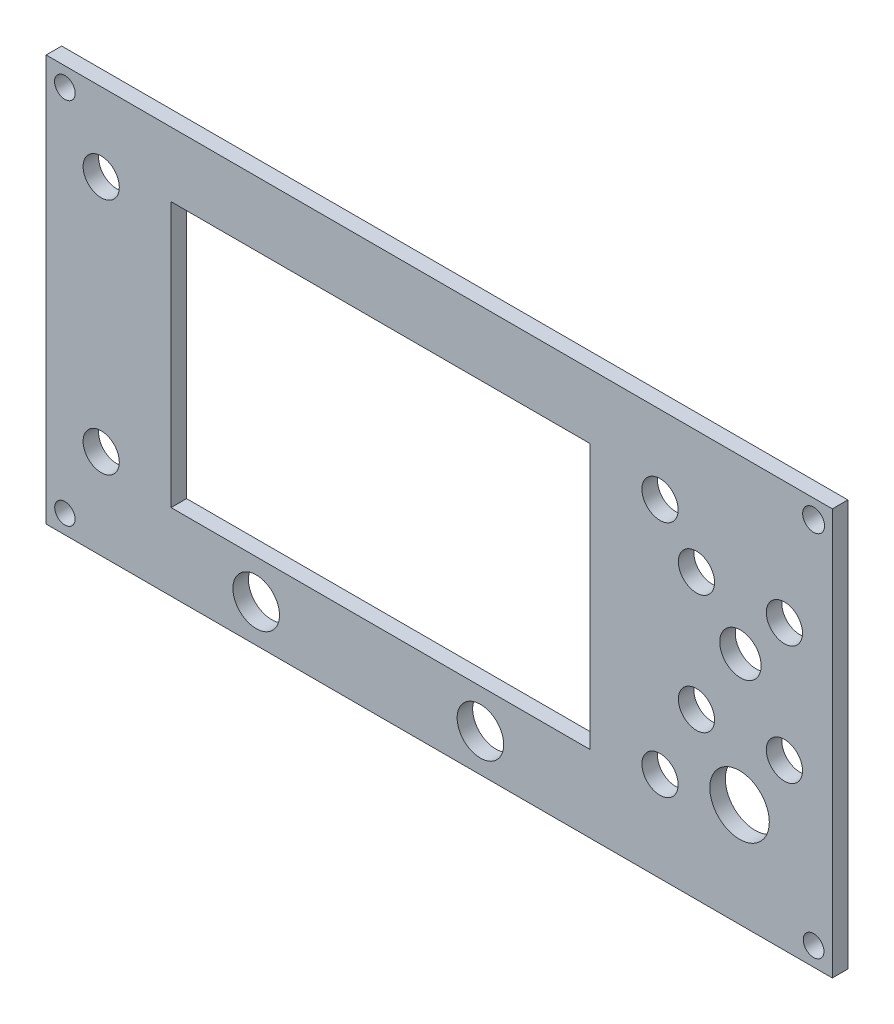
ISO-10303-21;
HEADER;
FILE_DESCRIPTION(('STEP AP214'),'2;1');
FILE_NAME('part.step','',(''),(''),'','','');
FILE_SCHEMA(('AUTOMOTIVE_DESIGN { 1 0 10303 214 1 1 1 1 }'));
ENDSEC;
DATA;
#1=APPLICATION_CONTEXT('core data for automotive mechanical design processes');
#2=APPLICATION_PROTOCOL_DEFINITION('international standard','automotive_design',2000,#1);
#3=PRODUCT_CONTEXT('',#1,'mechanical');
#4=PRODUCT('Part','Part','',(#3));
#5=PRODUCT_RELATED_PRODUCT_CATEGORY('part','',(#4));
#6=PRODUCT_DEFINITION_FORMATION('','',#4);
#7=PRODUCT_DEFINITION_CONTEXT('part definition',#1,'design');
#8=PRODUCT_DEFINITION('design','',#6,#7);
#9=PRODUCT_DEFINITION_SHAPE('','',#8);
#10=(LENGTH_UNIT() NAMED_UNIT(*) SI_UNIT(.MILLI.,.METRE.));
#11=(NAMED_UNIT(*) PLANE_ANGLE_UNIT() SI_UNIT($,.RADIAN.));
#12=(NAMED_UNIT(*) SI_UNIT($,.STERADIAN.) SOLID_ANGLE_UNIT());
#13=UNCERTAINTY_MEASURE_WITH_UNIT(LENGTH_MEASURE(1.E-05),#10,'distance_accuracy_value','');
#14=(GEOMETRIC_REPRESENTATION_CONTEXT(3) GLOBAL_UNCERTAINTY_ASSIGNED_CONTEXT((#13)) GLOBAL_UNIT_ASSIGNED_CONTEXT((#10,
#11,#12)) REPRESENTATION_CONTEXT('',''));
#15=CARTESIAN_POINT('',(0.,0.,0.));
#16=DIRECTION('',(0.,0.,1.));
#17=DIRECTION('',(1.,0.,0.));
#18=AXIS2_PLACEMENT_3D('',#15,#16,#17);
#19=CARTESIAN_POINT('',(-115.589634864552,35.6628504621788,3.8));
#20=DIRECTION('',(0.,0.,1.));
#21=DIRECTION('',(1.,0.,0.));
#22=AXIS2_PLACEMENT_3D('',#19,#20,#21);
#23=PLANE('',#22);
#24=DIRECTION('',(1.,0.,0.));
#25=VECTOR('',#24,1.);
#26=CARTESIAN_POINT('',(-112.589634864552,-38.6113828011498,3.8));
#27=LINE('',#26,#25);
#28=CARTESIAN_POINT('',(-119.832275551671,-38.6113828011498,3.8));
#29=VERTEX_POINT('',#28);
#30=CARTESIAN_POINT('',(32.1074936677452,-38.6113828011498,3.8));
#31=VERTEX_POINT('',#30);
#32=EDGE_CURVE('E103',#29,#31,#27,.T.);
#33=ORIENTED_EDGE('',*,*,#32,.T.);
#34=DIRECTION('',(0.,1.,0.));
#35=VECTOR('',#34,1.);
#36=CARTESIAN_POINT('',(32.1074936677452,32.6628504621788,3.8));
#37=LINE('',#36,#35);
#38=CARTESIAN_POINT('',(32.1074936677452,39.9054911492981,3.8));
#39=VERTEX_POINT('',#38);
#40=EDGE_CURVE('E44',#31,#39,#37,.T.);
#41=ORIENTED_EDGE('',*,*,#40,.T.);
#42=DIRECTION('',(-1.,0.,0.));
#43=VECTOR('',#42,1.);
#44=CARTESIAN_POINT('',(-112.589634864552,39.9054911492981,3.8));
#45=LINE('',#44,#43);
#46=CARTESIAN_POINT('',(-119.832275551672,39.9054911492981,3.8));
#47=VERTEX_POINT('',#46);
#48=EDGE_CURVE('E11',#39,#47,#45,.T.);
#49=ORIENTED_EDGE('',*,*,#48,.T.);
#50=DIRECTION('',(0.,-1.,0.));
#51=VECTOR('',#50,1.);
#52=CARTESIAN_POINT('',(-119.832275551672,32.6628504621788,3.8));
#53=LINE('',#52,#51);
#54=EDGE_CURVE('E107',#47,#29,#53,.T.);
#55=ORIENTED_EDGE('',*,*,#54,.T.);
#56=EDGE_LOOP('',(#33,#41,#49,#55));
#57=FACE_BOUND('',#56,.T.);
#58=CARTESIAN_POINT('',(-35.9055575731451,-31.3167182927098,3.8));
#59=DIRECTION('',(0.,0.,1.));
#60=DIRECTION('',(1.,0.,0.));
#61=AXIS2_PLACEMENT_3D('',#58,#59,#60);
#62=CIRCLE('',#61,4.5);
#63=CARTESIAN_POINT('',(-31.4055575731451,-31.3167182927098,3.8));
#64=VERTEX_POINT('',#63);
#65=EDGE_CURVE('E163',#64,#64,#62,.T.);
#66=ORIENTED_EDGE('',*,*,#65,.F.);
#67=EDGE_LOOP('',(#66));
#68=FACE_BOUND('',#67,.T.);
#69=CARTESIAN_POINT('',(5.84522459718796,-6.79565746544466,3.8));
#70=DIRECTION('',(0.,0.,1.));
#71=DIRECTION('',(1.,0.,0.));
#72=AXIS2_PLACEMENT_3D('',#69,#70,#71);
#73=CIRCLE('',#72,3.5);
#74=CARTESIAN_POINT('',(9.34522459718795,-6.79565746544466,3.8));
#75=VERTEX_POINT('',#74);
#76=EDGE_CURVE('E175',#75,#75,#73,.T.);
#77=ORIENTED_EDGE('',*,*,#76,.F.);
#78=EDGE_LOOP('',(#77));
#79=FACE_BOUND('',#78,.T.);
#80=CARTESIAN_POINT('',(22.845224597188,16.2043425345553,3.8));
#81=DIRECTION('',(0.,0.,1.));
#82=DIRECTION('',(1.,0.,0.));
#83=AXIS2_PLACEMENT_3D('',#80,#81,#82);
#84=CIRCLE('',#83,3.5);
#85=CARTESIAN_POINT('',(26.345224597188,16.2043425345553,3.8));
#86=VERTEX_POINT('',#85);
#87=EDGE_CURVE('E187',#86,#86,#84,.T.);
#88=ORIENTED_EDGE('',*,*,#87,.F.);
#89=EDGE_LOOP('',(#88));
#90=FACE_BOUND('',#89,.T.);
#91=CARTESIAN_POINT('',(14.3452245971879,6.74985267444258,3.8));
#92=DIRECTION('',(0.,0.,1.));
#93=DIRECTION('',(1.,0.,0.));
#94=AXIS2_PLACEMENT_3D('',#91,#92,#93);
#95=CIRCLE('',#94,4.);
#96=CARTESIAN_POINT('',(18.3452245971879,6.74985267444258,3.8));
#97=VERTEX_POINT('',#96);
#98=EDGE_CURVE('E199',#97,#97,#95,.T.);
#99=ORIENTED_EDGE('',*,*,#98,.F.);
#100=EDGE_LOOP('',(#99));
#101=FACE_BOUND('',#100,.T.);
#102=CARTESIAN_POINT('',(-1.1944174376666,-21.1785714285714,3.8));
#103=DIRECTION('',(0.,0.,1.));
#104=DIRECTION('',(1.,0.,0.));
#105=AXIS2_PLACEMENT_3D('',#102,#103,#104);
#106=CIRCLE('',#105,3.5);
#107=CARTESIAN_POINT('',(2.3055825623334,-21.1785714285714,3.8));
#108=VERTEX_POINT('',#107);
#109=EDGE_CURVE('E236',#108,#108,#106,.T.);
#110=ORIENTED_EDGE('',*,*,#109,.F.);
#111=EDGE_LOOP('',(#110));
#112=FACE_BOUND('',#111,.T.);
#113=CARTESIAN_POINT('',(-109.194417437667,24.8214285714286,3.8));
#114=DIRECTION('',(0.,0.,1.));
#115=DIRECTION('',(1.,0.,0.));
#116=AXIS2_PLACEMENT_3D('',#113,#114,#115);
#117=CIRCLE('',#116,3.50000000000001);
#118=CARTESIAN_POINT('',(-105.694417437667,24.8214285714286,3.8));
#119=VERTEX_POINT('',#118);
#120=EDGE_CURVE('E248',#119,#119,#117,.T.);
#121=ORIENTED_EDGE('',*,*,#120,.F.);
#122=EDGE_LOOP('',(#121));
#123=FACE_BOUND('',#122,.T.);
#124=CARTESIAN_POINT('',(-1.19441743766659,24.8214285714286,3.8));
#125=DIRECTION('',(0.,0.,1.));
#126=DIRECTION('',(1.,0.,0.));
#127=AXIS2_PLACEMENT_3D('',#124,#125,#126);
#128=CIRCLE('',#127,3.5);
#129=CARTESIAN_POINT('',(2.30558256233341,24.8214285714286,3.8));
#130=VERTEX_POINT('',#129);
#131=EDGE_CURVE('E242',#130,#130,#128,.T.);
#132=ORIENTED_EDGE('',*,*,#131,.F.);
#133=EDGE_LOOP('',(#132));
#134=FACE_BOUND('',#133,.T.);
#135=CARTESIAN_POINT('',(-109.194417437667,-21.1785714285714,3.8));
#136=DIRECTION('',(0.,0.,1.));
#137=DIRECTION('',(1.,0.,0.));
#138=AXIS2_PLACEMENT_3D('',#135,#136,#137);
#139=CIRCLE('',#138,3.50000000000001);
#140=CARTESIAN_POINT('',(-105.694417437667,-21.1785714285714,3.8));
#141=VERTEX_POINT('',#140);
#142=EDGE_CURVE('E230',#141,#141,#139,.T.);
#143=ORIENTED_EDGE('',*,*,#142,.F.);
#144=EDGE_LOOP('',(#143));
#145=FACE_BOUND('',#144,.T.);
#146=DIRECTION('',(1.,0.,0.));
#147=VECTOR('',#146,1.);
#148=CARTESIAN_POINT('',(-95.6944174376666,-23.7785714285714,3.8));
#149=LINE('',#148,#147);
#150=CARTESIAN_POINT('',(-95.6944174376666,-23.7785714285714,3.8));
#151=VERTEX_POINT('',#150);
#152=CARTESIAN_POINT('',(-14.6944174376666,-23.7785714285714,3.8));
#153=VERTEX_POINT('',#152);
#154=EDGE_CURVE('E206',#151,#153,#149,.T.);
#155=ORIENTED_EDGE('',*,*,#154,.F.);
#156=DIRECTION('',(0.,-1.,0.));
#157=VECTOR('',#156,1.);
#158=CARTESIAN_POINT('',(-95.6944174376666,27.4214285714286,3.8));
#159=LINE('',#158,#157);
#160=CARTESIAN_POINT('',(-95.6944174376666,27.4214285714286,3.8));
#161=VERTEX_POINT('',#160);
#162=EDGE_CURVE('E204',#161,#151,#159,.T.);
#163=ORIENTED_EDGE('',*,*,#162,.F.);
#164=DIRECTION('',(-1.,0.,0.));
#165=VECTOR('',#164,1.);
#166=CARTESIAN_POINT('',(-95.6944174376666,27.4214285714286,3.8));
#167=LINE('',#166,#165);
#168=CARTESIAN_POINT('',(-14.6944174376666,27.4214285714286,3.8));
#169=VERTEX_POINT('',#168);
#170=EDGE_CURVE('E211',#169,#161,#167,.T.);
#171=ORIENTED_EDGE('',*,*,#170,.F.);
#172=DIRECTION('',(0.,1.,0.));
#173=VECTOR('',#172,1.);
#174=CARTESIAN_POINT('',(-14.6944174376666,27.4214285714286,3.8));
#175=LINE('',#174,#173);
#176=EDGE_CURVE('E209',#153,#169,#175,.T.);
#177=ORIENTED_EDGE('',*,*,#176,.F.);
#178=EDGE_LOOP('',(#155,#163,#171,#177));
#179=FACE_BOUND('',#178,.T.);
#180=CARTESIAN_POINT('',(5.84522459718796,16.2043425345553,3.8));
#181=DIRECTION('',(0.,0.,1.));
#182=DIRECTION('',(1.,0.,0.));
#183=AXIS2_PLACEMENT_3D('',#180,#181,#182);
#184=CIRCLE('',#183,3.5);
#185=CARTESIAN_POINT('',(9.34522459718795,16.2043425345553,3.8));
#186=VERTEX_POINT('',#185);
#187=EDGE_CURVE('E193',#186,#186,#184,.T.);
#188=ORIENTED_EDGE('',*,*,#187,.F.);
#189=EDGE_LOOP('',(#188));
#190=FACE_BOUND('',#189,.T.);
#191=CARTESIAN_POINT('',(22.845224597188,-6.79565746544467,3.8));
#192=DIRECTION('',(0.,0.,1.));
#193=DIRECTION('',(1.,0.,0.));
#194=AXIS2_PLACEMENT_3D('',#191,#192,#193);
#195=CIRCLE('',#194,3.5);
#196=CARTESIAN_POINT('',(26.345224597188,-6.79565746544467,3.8));
#197=VERTEX_POINT('',#196);
#198=EDGE_CURVE('E181',#197,#197,#195,.T.);
#199=ORIENTED_EDGE('',*,*,#198,.F.);
#200=EDGE_LOOP('',(#199));
#201=FACE_BOUND('',#200,.T.);
#202=CARTESIAN_POINT('',(14.1765521793274,-18.6113828011496,3.8));
#203=DIRECTION('',(0.,0.,1.));
#204=DIRECTION('',(1.,0.,0.));
#205=AXIS2_PLACEMENT_3D('',#202,#203,#204);
#206=CIRCLE('',#205,5.74999999999999);
#207=CARTESIAN_POINT('',(19.9265521793274,-18.6113828011496,3.8));
#208=VERTEX_POINT('',#207);
#209=EDGE_CURVE('E169',#208,#208,#206,.T.);
#210=ORIENTED_EDGE('',*,*,#209,.F.);
#211=EDGE_LOOP('',(#210));
#212=FACE_BOUND('',#211,.T.);
#213=CARTESIAN_POINT('',(-79.2375087091907,-31.3167182927098,3.8));
#214=DIRECTION('',(0.,0.,1.));
#215=DIRECTION('',(1.,0.,0.));
#216=AXIS2_PLACEMENT_3D('',#213,#214,#215);
#217=CIRCLE('',#216,4.5);
#218=CARTESIAN_POINT('',(-74.7375087091907,-31.3167182927098,3.8));
#219=VERTEX_POINT('',#218);
#220=EDGE_CURVE('E157',#219,#219,#217,.T.);
#221=ORIENTED_EDGE('',*,*,#220,.F.);
#222=EDGE_LOOP('',(#221));
#223=FACE_BOUND('',#222,.T.);
#224=CARTESIAN_POINT('',(-116.210955208112,-34.9900624575901,3.8));
#225=DIRECTION('',(0.,0.,1.));
#226=DIRECTION('',(1.,0.,0.));
#227=AXIS2_PLACEMENT_3D('',#224,#225,#226);
#228=CIRCLE('',#227,1.96530420165224);
#229=CARTESIAN_POINT('',(-114.24565100646,-34.9900624575901,3.8));
#230=VERTEX_POINT('',#229);
#231=EDGE_CURVE('E149',#230,#230,#228,.T.);
#232=ORIENTED_EDGE('',*,*,#231,.F.);
#233=EDGE_LOOP('',(#232));
#234=FACE_BOUND('',#233,.T.);
#235=CARTESIAN_POINT('',(-116.210955208112,36.2841708057384,3.8));
#236=DIRECTION('',(0.,0.,1.));
#237=DIRECTION('',(1.,0.,0.));
#238=AXIS2_PLACEMENT_3D('',#235,#236,#237);
#239=CIRCLE('',#238,2.00000000000001);
#240=CARTESIAN_POINT('',(-114.210955208112,36.2841708057384,3.8));
#241=VERTEX_POINT('',#240);
#242=EDGE_CURVE('E140',#241,#241,#239,.T.);
#243=ORIENTED_EDGE('',*,*,#242,.F.);
#244=EDGE_LOOP('',(#243));
#245=FACE_BOUND('',#244,.T.);
#246=CARTESIAN_POINT('',(28.4861733241856,36.2841708057384,3.8));
#247=DIRECTION('',(0.,0.,1.));
#248=DIRECTION('',(1.,0.,0.));
#249=AXIS2_PLACEMENT_3D('',#246,#247,#248);
#250=CIRCLE('',#249,2.11348636938539);
#251=CARTESIAN_POINT('',(30.599659693571,36.2841708057384,3.8));
#252=VERTEX_POINT('',#251);
#253=EDGE_CURVE('E129',#252,#252,#250,.T.);
#254=ORIENTED_EDGE('',*,*,#253,.F.);
#255=EDGE_LOOP('',(#254));
#256=FACE_BOUND('',#255,.T.);
#257=CARTESIAN_POINT('',(28.4861733241856,-34.9900624575901,3.8));
#258=DIRECTION('',(0.,0.,1.));
#259=DIRECTION('',(1.,0.,0.));
#260=AXIS2_PLACEMENT_3D('',#257,#258,#259);
#261=CIRCLE('',#260,2.00000000000001);
#262=CARTESIAN_POINT('',(30.4861733241856,-34.9900624575901,3.8));
#263=VERTEX_POINT('',#262);
#264=EDGE_CURVE('E126',#263,#263,#261,.T.);
#265=ORIENTED_EDGE('',*,*,#264,.F.);
#266=EDGE_LOOP('',(#265));
#267=FACE_BOUND('',#266,.T.);
#268=ADVANCED_FACE('F35',(#57,#68,#79,#90,#101,#112,#123,#134,#145,#179,#190,#201,#212,#223,
#234,#245,#256,#267),#23,.T.);
#269=CARTESIAN_POINT('',(-115.589634864552,35.6628504621788,0.8));
#270=DIRECTION('',(0.,0.,1.));
#271=DIRECTION('',(1.,0.,0.));
#272=AXIS2_PLACEMENT_3D('',#269,#270,#271);
#273=PLANE('',#272);
#274=DIRECTION('',(0.,1.,0.));
#275=VECTOR('',#274,1.);
#276=CARTESIAN_POINT('',(32.1074936677452,32.6628504621788,0.8));
#277=LINE('',#276,#275);
#278=CARTESIAN_POINT('',(32.1074936677452,-38.6113828011498,0.8));
#279=VERTEX_POINT('',#278);
#280=CARTESIAN_POINT('',(32.1074936677452,39.9054911492981,0.8));
#281=VERTEX_POINT('',#280);
#282=EDGE_CURVE('E256',#279,#281,#277,.T.);
#283=ORIENTED_EDGE('',*,*,#282,.F.);
#284=DIRECTION('',(1.,0.,0.));
#285=VECTOR('',#284,1.);
#286=CARTESIAN_POINT('',(-112.589634864552,-38.6113828011498,0.8));
#287=LINE('',#286,#285);
#288=CARTESIAN_POINT('',(-119.832275551671,-38.6113828011498,0.8));
#289=VERTEX_POINT('',#288);
#290=EDGE_CURVE('E123',#289,#279,#287,.T.);
#291=ORIENTED_EDGE('',*,*,#290,.F.);
#292=DIRECTION('',(0.,-1.,0.));
#293=VECTOR('',#292,1.);
#294=CARTESIAN_POINT('',(-119.832275551672,32.6628504621788,0.8));
#295=LINE('',#294,#293);
#296=CARTESIAN_POINT('',(-119.832275551672,39.9054911492981,0.8));
#297=VERTEX_POINT('',#296);
#298=EDGE_CURVE('E251',#297,#289,#295,.T.);
#299=ORIENTED_EDGE('',*,*,#298,.F.);
#300=DIRECTION('',(-1.,0.,0.));
#301=VECTOR('',#300,1.);
#302=CARTESIAN_POINT('',(-112.589634864552,39.9054911492981,0.8));
#303=LINE('',#302,#301);
#304=EDGE_CURVE('E39',#281,#297,#303,.T.);
#305=ORIENTED_EDGE('',*,*,#304,.F.);
#306=EDGE_LOOP('',(#283,#291,#299,#305));
#307=FACE_BOUND('',#306,.T.);
#308=CARTESIAN_POINT('',(28.4861733241856,36.2841708057384,0.8));
#309=DIRECTION('',(0.,0.,1.));
#310=DIRECTION('',(1.,0.,0.));
#311=AXIS2_PLACEMENT_3D('',#308,#309,#310);
#312=CIRCLE('',#311,2.11348636938539);
#313=CARTESIAN_POINT('',(30.599659693571,36.2841708057384,0.8));
#314=VERTEX_POINT('',#313);
#315=EDGE_CURVE('E125',#314,#314,#312,.T.);
#316=ORIENTED_EDGE('',*,*,#315,.T.);
#317=EDGE_LOOP('',(#316));
#318=FACE_BOUND('',#317,.T.);
#319=CARTESIAN_POINT('',(-116.210955208112,-34.9900624575901,0.8));
#320=DIRECTION('',(0.,0.,1.));
#321=DIRECTION('',(1.,0.,0.));
#322=AXIS2_PLACEMENT_3D('',#319,#320,#321);
#323=CIRCLE('',#322,1.96530420165224);
#324=CARTESIAN_POINT('',(-114.24565100646,-34.9900624575901,0.8));
#325=VERTEX_POINT('',#324);
#326=EDGE_CURVE('E148',#325,#325,#323,.T.);
#327=ORIENTED_EDGE('',*,*,#326,.T.);
#328=EDGE_LOOP('',(#327));
#329=FACE_BOUND('',#328,.T.);
#330=CARTESIAN_POINT('',(-109.194417437667,-21.1785714285714,0.8));
#331=DIRECTION('',(0.,0.,1.));
#332=DIRECTION('',(1.,0.,0.));
#333=AXIS2_PLACEMENT_3D('',#330,#331,#332);
#334=CIRCLE('',#333,3.50000000000001);
#335=CARTESIAN_POINT('',(-105.694417437667,-21.1785714285714,0.8));
#336=VERTEX_POINT('',#335);
#337=EDGE_CURVE('E229',#336,#336,#334,.T.);
#338=ORIENTED_EDGE('',*,*,#337,.T.);
#339=EDGE_LOOP('',(#338));
#340=FACE_BOUND('',#339,.T.);
#341=CARTESIAN_POINT('',(-1.1944174376666,-21.1785714285714,0.8));
#342=DIRECTION('',(0.,0.,1.));
#343=DIRECTION('',(1.,0.,0.));
#344=AXIS2_PLACEMENT_3D('',#341,#342,#343);
#345=CIRCLE('',#344,3.5);
#346=CARTESIAN_POINT('',(2.3055825623334,-21.1785714285714,0.8));
#347=VERTEX_POINT('',#346);
#348=EDGE_CURVE('E233',#347,#347,#345,.T.);
#349=ORIENTED_EDGE('',*,*,#348,.T.);
#350=EDGE_LOOP('',(#349));
#351=FACE_BOUND('',#350,.T.);
#352=CARTESIAN_POINT('',(-1.19441743766659,24.8214285714286,0.8));
#353=DIRECTION('',(0.,0.,1.));
#354=DIRECTION('',(1.,0.,0.));
#355=AXIS2_PLACEMENT_3D('',#352,#353,#354);
#356=CIRCLE('',#355,3.5);
#357=CARTESIAN_POINT('',(2.30558256233341,24.8214285714286,0.8));
#358=VERTEX_POINT('',#357);
#359=EDGE_CURVE('E239',#358,#358,#356,.T.);
#360=ORIENTED_EDGE('',*,*,#359,.T.);
#361=EDGE_LOOP('',(#360));
#362=FACE_BOUND('',#361,.T.);
#363=CARTESIAN_POINT('',(-109.194417437667,24.8214285714286,0.8));
#364=DIRECTION('',(0.,0.,1.));
#365=DIRECTION('',(1.,0.,0.));
#366=AXIS2_PLACEMENT_3D('',#363,#364,#365);
#367=CIRCLE('',#366,3.50000000000001);
#368=CARTESIAN_POINT('',(-105.694417437667,24.8214285714286,0.8));
#369=VERTEX_POINT('',#368);
#370=EDGE_CURVE('E245',#369,#369,#367,.T.);
#371=ORIENTED_EDGE('',*,*,#370,.T.);
#372=EDGE_LOOP('',(#371));
#373=FACE_BOUND('',#372,.T.);
#374=DIRECTION('',(0.,-1.,0.));
#375=VECTOR('',#374,1.);
#376=CARTESIAN_POINT('',(-95.6944174376666,27.4214285714286,0.8));
#377=LINE('',#376,#375);
#378=CARTESIAN_POINT('',(-95.6944174376666,27.4214285714286,0.8));
#379=VERTEX_POINT('',#378);
#380=CARTESIAN_POINT('',(-95.6944174376666,-23.7785714285714,0.8));
#381=VERTEX_POINT('',#380);
#382=EDGE_CURVE('E60',#379,#381,#377,.T.);
#383=ORIENTED_EDGE('',*,*,#382,.T.);
#384=DIRECTION('',(1.,0.,0.));
#385=VECTOR('',#384,1.);
#386=CARTESIAN_POINT('',(-95.6944174376666,-23.7785714285714,0.8));
#387=LINE('',#386,#385);
#388=CARTESIAN_POINT('',(-14.6944174376666,-23.7785714285714,0.8));
#389=VERTEX_POINT('',#388);
#390=EDGE_CURVE('E215',#381,#389,#387,.T.);
#391=ORIENTED_EDGE('',*,*,#390,.T.);
#392=DIRECTION('',(0.,1.,0.));
#393=VECTOR('',#392,1.);
#394=CARTESIAN_POINT('',(-14.6944174376666,27.4214285714286,0.8));
#395=LINE('',#394,#393);
#396=CARTESIAN_POINT('',(-14.6944174376666,27.4214285714286,0.8));
#397=VERTEX_POINT('',#396);
#398=EDGE_CURVE('E218',#389,#397,#395,.T.);
#399=ORIENTED_EDGE('',*,*,#398,.T.);
#400=DIRECTION('',(-1.,0.,0.));
#401=VECTOR('',#400,1.);
#402=CARTESIAN_POINT('',(-95.6944174376666,27.4214285714286,0.8));
#403=LINE('',#402,#401);
#404=EDGE_CURVE('E207',#397,#379,#403,.T.);
#405=ORIENTED_EDGE('',*,*,#404,.T.);
#406=EDGE_LOOP('',(#383,#391,#399,#405));
#407=FACE_BOUND('',#406,.T.);
#408=CARTESIAN_POINT('',(14.3452245971879,6.74985267444258,0.8));
#409=DIRECTION('',(0.,0.,1.));
#410=DIRECTION('',(1.,0.,0.));
#411=AXIS2_PLACEMENT_3D('',#408,#409,#410);
#412=CIRCLE('',#411,4.);
#413=CARTESIAN_POINT('',(18.3452245971879,6.74985267444258,0.8));
#414=VERTEX_POINT('',#413);
#415=EDGE_CURVE('E196',#414,#414,#412,.T.);
#416=ORIENTED_EDGE('',*,*,#415,.T.);
#417=EDGE_LOOP('',(#416));
#418=FACE_BOUND('',#417,.T.);
#419=CARTESIAN_POINT('',(5.84522459718796,16.2043425345553,0.8));
#420=DIRECTION('',(0.,0.,1.));
#421=DIRECTION('',(1.,0.,0.));
#422=AXIS2_PLACEMENT_3D('',#419,#420,#421);
#423=CIRCLE('',#422,3.5);
#424=CARTESIAN_POINT('',(9.34522459718795,16.2043425345553,0.8));
#425=VERTEX_POINT('',#424);
#426=EDGE_CURVE('E190',#425,#425,#423,.T.);
#427=ORIENTED_EDGE('',*,*,#426,.T.);
#428=EDGE_LOOP('',(#427));
#429=FACE_BOUND('',#428,.T.);
#430=CARTESIAN_POINT('',(22.845224597188,16.2043425345553,0.8));
#431=DIRECTION('',(0.,0.,1.));
#432=DIRECTION('',(1.,0.,0.));
#433=AXIS2_PLACEMENT_3D('',#430,#431,#432);
#434=CIRCLE('',#433,3.5);
#435=CARTESIAN_POINT('',(26.345224597188,16.2043425345553,0.8));
#436=VERTEX_POINT('',#435);
#437=EDGE_CURVE('E184',#436,#436,#434,.T.);
#438=ORIENTED_EDGE('',*,*,#437,.T.);
#439=EDGE_LOOP('',(#438));
#440=FACE_BOUND('',#439,.T.);
#441=CARTESIAN_POINT('',(22.845224597188,-6.79565746544467,0.8));
#442=DIRECTION('',(0.,0.,1.));
#443=DIRECTION('',(1.,0.,0.));
#444=AXIS2_PLACEMENT_3D('',#441,#442,#443);
#445=CIRCLE('',#444,3.5);
#446=CARTESIAN_POINT('',(26.345224597188,-6.79565746544467,0.8));
#447=VERTEX_POINT('',#446);
#448=EDGE_CURVE('E178',#447,#447,#445,.T.);
#449=ORIENTED_EDGE('',*,*,#448,.T.);
#450=EDGE_LOOP('',(#449));
#451=FACE_BOUND('',#450,.T.);
#452=CARTESIAN_POINT('',(5.84522459718796,-6.79565746544466,0.8));
#453=DIRECTION('',(0.,0.,1.));
#454=DIRECTION('',(1.,0.,0.));
#455=AXIS2_PLACEMENT_3D('',#452,#453,#454);
#456=CIRCLE('',#455,3.5);
#457=CARTESIAN_POINT('',(9.34522459718795,-6.79565746544466,0.8));
#458=VERTEX_POINT('',#457);
#459=EDGE_CURVE('E172',#458,#458,#456,.T.);
#460=ORIENTED_EDGE('',*,*,#459,.T.);
#461=EDGE_LOOP('',(#460));
#462=FACE_BOUND('',#461,.T.);
#463=CARTESIAN_POINT('',(14.1765521793274,-18.6113828011496,0.8));
#464=DIRECTION('',(0.,0.,1.));
#465=DIRECTION('',(1.,0.,0.));
#466=AXIS2_PLACEMENT_3D('',#463,#464,#465);
#467=CIRCLE('',#466,5.74999999999999);
#468=CARTESIAN_POINT('',(19.9265521793274,-18.6113828011496,0.8));
#469=VERTEX_POINT('',#468);
#470=EDGE_CURVE('E166',#469,#469,#467,.T.);
#471=ORIENTED_EDGE('',*,*,#470,.T.);
#472=EDGE_LOOP('',(#471));
#473=FACE_BOUND('',#472,.T.);
#474=CARTESIAN_POINT('',(-35.9055575731451,-31.3167182927098,0.8));
#475=DIRECTION('',(0.,0.,1.));
#476=DIRECTION('',(1.,0.,0.));
#477=AXIS2_PLACEMENT_3D('',#474,#475,#476);
#478=CIRCLE('',#477,4.5);
#479=CARTESIAN_POINT('',(-31.4055575731451,-31.3167182927098,0.8));
#480=VERTEX_POINT('',#479);
#481=EDGE_CURVE('E160',#480,#480,#478,.T.);
#482=ORIENTED_EDGE('',*,*,#481,.T.);
#483=EDGE_LOOP('',(#482));
#484=FACE_BOUND('',#483,.T.);
#485=CARTESIAN_POINT('',(-79.2375087091907,-31.3167182927098,0.8));
#486=DIRECTION('',(0.,0.,1.));
#487=DIRECTION('',(1.,0.,0.));
#488=AXIS2_PLACEMENT_3D('',#485,#486,#487);
#489=CIRCLE('',#488,4.5);
#490=CARTESIAN_POINT('',(-74.7375087091907,-31.3167182927098,0.8));
#491=VERTEX_POINT('',#490);
#492=EDGE_CURVE('E156',#491,#491,#489,.T.);
#493=ORIENTED_EDGE('',*,*,#492,.T.);
#494=EDGE_LOOP('',(#493));
#495=FACE_BOUND('',#494,.T.);
#496=CARTESIAN_POINT('',(-116.210955208112,36.2841708057384,0.8));
#497=DIRECTION('',(0.,0.,1.));
#498=DIRECTION('',(1.,0.,0.));
#499=AXIS2_PLACEMENT_3D('',#496,#497,#498);
#500=CIRCLE('',#499,2.00000000000001);
#501=CARTESIAN_POINT('',(-114.210955208112,36.2841708057384,0.8));
#502=VERTEX_POINT('',#501);
#503=EDGE_CURVE('E139',#502,#502,#500,.T.);
#504=ORIENTED_EDGE('',*,*,#503,.T.);
#505=EDGE_LOOP('',(#504));
#506=FACE_BOUND('',#505,.T.);
#507=CARTESIAN_POINT('',(28.4861733241856,-34.9900624575901,0.8));
#508=DIRECTION('',(0.,0.,1.));
#509=DIRECTION('',(1.,0.,0.));
#510=AXIS2_PLACEMENT_3D('',#507,#508,#509);
#511=CIRCLE('',#510,2.00000000000001);
#512=CARTESIAN_POINT('',(30.4861733241856,-34.9900624575901,0.8));
#513=VERTEX_POINT('',#512);
#514=EDGE_CURVE('E132',#513,#513,#511,.T.);
#515=ORIENTED_EDGE('',*,*,#514,.T.);
#516=EDGE_LOOP('',(#515));
#517=FACE_BOUND('',#516,.T.);
#518=ADVANCED_FACE('F264',(#307,#318,#329,#340,#351,#362,#373,#407,#418,#429,#440,#451,#462,
#473,#484,#495,#506,#517),#273,.F.);
#519=CARTESIAN_POINT('',(-119.832275551672,32.6628504621788,3.8));
#520=DIRECTION('',(1.,0.,0.));
#521=DIRECTION('',(0.,1.,0.));
#522=AXIS2_PLACEMENT_3D('',#519,#520,#521);
#523=PLANE('',#522);
#524=ORIENTED_EDGE('',*,*,#298,.T.);
#525=DIRECTION('',(0.,0.,-1.));
#526=VECTOR('',#525,1.);
#527=CARTESIAN_POINT('',(-119.832275551671,-38.6113828011498,3.8));
#528=LINE('',#527,#526);
#529=EDGE_CURVE('E152',#29,#289,#528,.T.);
#530=ORIENTED_EDGE('',*,*,#529,.F.);
#531=ORIENTED_EDGE('',*,*,#54,.F.);
#532=DIRECTION('',(0.,0.,-1.));
#533=VECTOR('',#532,1.);
#534=CARTESIAN_POINT('',(-119.832275551672,39.9054911492981,3.8));
#535=LINE('',#534,#533);
#536=EDGE_CURVE('E143',#47,#297,#535,.T.);
#537=ORIENTED_EDGE('',*,*,#536,.T.);
#538=EDGE_LOOP('',(#524,#530,#531,#537));
#539=FACE_BOUND('',#538,.T.);
#540=ADVANCED_FACE('F37',(#539),#523,.F.);
#541=CARTESIAN_POINT('',(-112.589634864552,-38.6113828011498,3.8));
#542=DIRECTION('',(0.,1.,0.));
#543=DIRECTION('',(0.,0.,1.));
#544=AXIS2_PLACEMENT_3D('',#541,#542,#543);
#545=PLANE('',#544);
#546=ORIENTED_EDGE('',*,*,#290,.T.);
#547=DIRECTION('',(0.,0.,-1.));
#548=VECTOR('',#547,1.);
#549=CARTESIAN_POINT('',(32.1074936677452,-38.6113828011498,3.8));
#550=LINE('',#549,#548);
#551=EDGE_CURVE('E117',#31,#279,#550,.T.);
#552=ORIENTED_EDGE('',*,*,#551,.F.);
#553=ORIENTED_EDGE('',*,*,#32,.F.);
#554=ORIENTED_EDGE('',*,*,#529,.T.);
#555=EDGE_LOOP('',(#546,#552,#553,#554));
#556=FACE_BOUND('',#555,.T.);
#557=ADVANCED_FACE('F121',(#556),#545,.F.);
#558=CARTESIAN_POINT('',(32.1074936677452,32.6628504621788,3.8));
#559=DIRECTION('',(-1.,0.,0.));
#560=DIRECTION('',(0.,-1.,0.));
#561=AXIS2_PLACEMENT_3D('',#558,#559,#560);
#562=PLANE('',#561);
#563=ORIENTED_EDGE('',*,*,#282,.T.);
#564=DIRECTION('',(0.,0.,-1.));
#565=VECTOR('',#564,1.);
#566=CARTESIAN_POINT('',(32.1074936677452,39.9054911492981,3.8));
#567=LINE('',#566,#565);
#568=EDGE_CURVE('E119',#39,#281,#567,.T.);
#569=ORIENTED_EDGE('',*,*,#568,.F.);
#570=ORIENTED_EDGE('',*,*,#40,.F.);
#571=ORIENTED_EDGE('',*,*,#551,.T.);
#572=EDGE_LOOP('',(#563,#569,#570,#571));
#573=FACE_BOUND('',#572,.T.);
#574=ADVANCED_FACE('F116',(#573),#562,.F.);
#575=CARTESIAN_POINT('',(-112.589634864552,39.9054911492981,3.8));
#576=DIRECTION('',(0.,-1.,0.));
#577=DIRECTION('',(0.,0.,-1.));
#578=AXIS2_PLACEMENT_3D('',#575,#576,#577);
#579=PLANE('',#578);
#580=ORIENTED_EDGE('',*,*,#304,.T.);
#581=ORIENTED_EDGE('',*,*,#536,.F.);
#582=ORIENTED_EDGE('',*,*,#48,.F.);
#583=ORIENTED_EDGE('',*,*,#568,.T.);
#584=EDGE_LOOP('',(#580,#581,#582,#583));
#585=FACE_BOUND('',#584,.T.);
#586=ADVANCED_FACE('F261',(#585),#579,.F.);
#587=CARTESIAN_POINT('',(-109.194417437667,24.8214285714286,3.8));
#588=DIRECTION('',(0.,0.,-1.));
#589=DIRECTION('',(-1.,0.,0.));
#590=AXIS2_PLACEMENT_3D('',#587,#588,#589);
#591=CYLINDRICAL_SURFACE('',#590,3.50000000000001);
#592=ORIENTED_EDGE('',*,*,#120,.T.);
#593=EDGE_LOOP('',(#592));
#594=FACE_BOUND('',#593,.T.);
#595=ORIENTED_EDGE('',*,*,#370,.F.);
#596=EDGE_LOOP('',(#595));
#597=FACE_BOUND('',#596,.T.);
#598=ADVANCED_FACE('F318',(#594,#597),#591,.F.);
#599=CARTESIAN_POINT('',(-1.19441743766659,24.8214285714286,3.8));
#600=DIRECTION('',(0.,0.,-1.));
#601=DIRECTION('',(-1.,0.,0.));
#602=AXIS2_PLACEMENT_3D('',#599,#600,#601);
#603=CYLINDRICAL_SURFACE('',#602,3.5);
#604=ORIENTED_EDGE('',*,*,#131,.T.);
#605=EDGE_LOOP('',(#604));
#606=FACE_BOUND('',#605,.T.);
#607=ORIENTED_EDGE('',*,*,#359,.F.);
#608=EDGE_LOOP('',(#607));
#609=FACE_BOUND('',#608,.T.);
#610=ADVANCED_FACE('F483',(#606,#609),#603,.F.);
#611=CARTESIAN_POINT('',(-1.1944174376666,-21.1785714285714,3.8));
#612=DIRECTION('',(0.,0.,-1.));
#613=DIRECTION('',(-1.,0.,0.));
#614=AXIS2_PLACEMENT_3D('',#611,#612,#613);
#615=CYLINDRICAL_SURFACE('',#614,3.5);
#616=ORIENTED_EDGE('',*,*,#109,.T.);
#617=EDGE_LOOP('',(#616));
#618=FACE_BOUND('',#617,.T.);
#619=ORIENTED_EDGE('',*,*,#348,.F.);
#620=EDGE_LOOP('',(#619));
#621=FACE_BOUND('',#620,.T.);
#622=ADVANCED_FACE('F473',(#618,#621),#615,.F.);
#623=CARTESIAN_POINT('',(-109.194417437667,-21.1785714285714,3.8));
#624=DIRECTION('',(0.,0.,-1.));
#625=DIRECTION('',(-1.,0.,0.));
#626=AXIS2_PLACEMENT_3D('',#623,#624,#625);
#627=CYLINDRICAL_SURFACE('',#626,3.50000000000001);
#628=ORIENTED_EDGE('',*,*,#142,.T.);
#629=EDGE_LOOP('',(#628));
#630=FACE_BOUND('',#629,.T.);
#631=ORIENTED_EDGE('',*,*,#337,.F.);
#632=EDGE_LOOP('',(#631));
#633=FACE_BOUND('',#632,.T.);
#634=ADVANCED_FACE('F464',(#630,#633),#627,.F.);
#635=CARTESIAN_POINT('',(-95.6944174376666,27.4214285714286,3.8));
#636=DIRECTION('',(1.,0.,0.));
#637=DIRECTION('',(0.,0.,-1.));
#638=AXIS2_PLACEMENT_3D('',#635,#636,#637);
#639=PLANE('',#638);
#640=ORIENTED_EDGE('',*,*,#382,.F.);
#641=DIRECTION('',(0.,0.,-1.));
#642=VECTOR('',#641,1.);
#643=CARTESIAN_POINT('',(-95.6944174376666,27.4214285714286,3.8));
#644=LINE('',#643,#642);
#645=EDGE_CURVE('E213',#161,#379,#644,.T.);
#646=ORIENTED_EDGE('',*,*,#645,.F.);
#647=ORIENTED_EDGE('',*,*,#162,.T.);
#648=DIRECTION('',(0.,0.,-1.));
#649=VECTOR('',#648,1.);
#650=CARTESIAN_POINT('',(-95.6944174376666,-23.7785714285714,3.8));
#651=LINE('',#650,#649);
#652=EDGE_CURVE('E227',#151,#381,#651,.T.);
#653=ORIENTED_EDGE('',*,*,#652,.T.);
#654=EDGE_LOOP('',(#640,#646,#647,#653));
#655=FACE_BOUND('',#654,.T.);
#656=ADVANCED_FACE('F454',(#655),#639,.T.);
#657=CARTESIAN_POINT('',(-95.6944174376666,-23.7785714285714,3.8));
#658=DIRECTION('',(0.,1.,0.));
#659=DIRECTION('',(0.,0.,1.));
#660=AXIS2_PLACEMENT_3D('',#657,#658,#659);
#661=PLANE('',#660);
#662=ORIENTED_EDGE('',*,*,#390,.F.);
#663=ORIENTED_EDGE('',*,*,#652,.F.);
#664=ORIENTED_EDGE('',*,*,#154,.T.);
#665=DIRECTION('',(0.,0.,-1.));
#666=VECTOR('',#665,1.);
#667=CARTESIAN_POINT('',(-14.6944174376666,-23.7785714285714,3.8));
#668=LINE('',#667,#666);
#669=EDGE_CURVE('E225',#153,#389,#668,.T.);
#670=ORIENTED_EDGE('',*,*,#669,.T.);
#671=EDGE_LOOP('',(#662,#663,#664,#670));
#672=FACE_BOUND('',#671,.T.);
#673=ADVANCED_FACE('F444',(#672),#661,.T.);
#674=CARTESIAN_POINT('',(-14.6944174376666,27.4214285714286,3.8));
#675=DIRECTION('',(-1.,0.,0.));
#676=DIRECTION('',(0.,0.,1.));
#677=AXIS2_PLACEMENT_3D('',#674,#675,#676);
#678=PLANE('',#677);
#679=ORIENTED_EDGE('',*,*,#398,.F.);
#680=ORIENTED_EDGE('',*,*,#669,.F.);
#681=ORIENTED_EDGE('',*,*,#176,.T.);
#682=DIRECTION('',(0.,0.,-1.));
#683=VECTOR('',#682,1.);
#684=CARTESIAN_POINT('',(-14.6944174376666,27.4214285714286,3.8));
#685=LINE('',#684,#683);
#686=EDGE_CURVE('E52',#169,#397,#685,.T.);
#687=ORIENTED_EDGE('',*,*,#686,.T.);
#688=EDGE_LOOP('',(#679,#680,#681,#687));
#689=FACE_BOUND('',#688,.T.);
#690=ADVANCED_FACE('F435',(#689),#678,.T.);
#691=CARTESIAN_POINT('',(-95.6944174376666,27.4214285714286,3.8));
#692=DIRECTION('',(0.,-1.,0.));
#693=DIRECTION('',(0.,0.,-1.));
#694=AXIS2_PLACEMENT_3D('',#691,#692,#693);
#695=PLANE('',#694);
#696=ORIENTED_EDGE('',*,*,#404,.F.);
#697=ORIENTED_EDGE('',*,*,#686,.F.);
#698=ORIENTED_EDGE('',*,*,#170,.T.);
#699=ORIENTED_EDGE('',*,*,#645,.T.);
#700=EDGE_LOOP('',(#696,#697,#698,#699));
#701=FACE_BOUND('',#700,.T.);
#702=ADVANCED_FACE('F425',(#701),#695,.T.);
#703=CARTESIAN_POINT('',(14.3452245971879,6.74985267444258,3.8));
#704=DIRECTION('',(0.,0.,-1.));
#705=DIRECTION('',(-1.,0.,0.));
#706=AXIS2_PLACEMENT_3D('',#703,#704,#705);
#707=CYLINDRICAL_SURFACE('',#706,4.);
#708=ORIENTED_EDGE('',*,*,#98,.T.);
#709=EDGE_LOOP('',(#708));
#710=FACE_BOUND('',#709,.T.);
#711=ORIENTED_EDGE('',*,*,#415,.F.);
#712=EDGE_LOOP('',(#711));
#713=FACE_BOUND('',#712,.T.);
#714=ADVANCED_FACE('F415',(#710,#713),#707,.F.);
#715=CARTESIAN_POINT('',(5.84522459718796,16.2043425345553,3.8));
#716=DIRECTION('',(0.,0.,-1.));
#717=DIRECTION('',(-1.,0.,0.));
#718=AXIS2_PLACEMENT_3D('',#715,#716,#717);
#719=CYLINDRICAL_SURFACE('',#718,3.5);
#720=ORIENTED_EDGE('',*,*,#187,.T.);
#721=EDGE_LOOP('',(#720));
#722=FACE_BOUND('',#721,.T.);
#723=ORIENTED_EDGE('',*,*,#426,.F.);
#724=EDGE_LOOP('',(#723));
#725=FACE_BOUND('',#724,.T.);
#726=ADVANCED_FACE('F405',(#722,#725),#719,.F.);
#727=CARTESIAN_POINT('',(22.845224597188,16.2043425345553,3.8));
#728=DIRECTION('',(0.,0.,-1.));
#729=DIRECTION('',(-1.,0.,0.));
#730=AXIS2_PLACEMENT_3D('',#727,#728,#729);
#731=CYLINDRICAL_SURFACE('',#730,3.5);
#732=ORIENTED_EDGE('',*,*,#87,.T.);
#733=EDGE_LOOP('',(#732));
#734=FACE_BOUND('',#733,.T.);
#735=ORIENTED_EDGE('',*,*,#437,.F.);
#736=EDGE_LOOP('',(#735));
#737=FACE_BOUND('',#736,.T.);
#738=ADVANCED_FACE('F395',(#734,#737),#731,.F.);
#739=CARTESIAN_POINT('',(22.845224597188,-6.79565746544467,3.8));
#740=DIRECTION('',(0.,0.,-1.));
#741=DIRECTION('',(-1.,0.,0.));
#742=AXIS2_PLACEMENT_3D('',#739,#740,#741);
#743=CYLINDRICAL_SURFACE('',#742,3.5);
#744=ORIENTED_EDGE('',*,*,#198,.T.);
#745=EDGE_LOOP('',(#744));
#746=FACE_BOUND('',#745,.T.);
#747=ORIENTED_EDGE('',*,*,#448,.F.);
#748=EDGE_LOOP('',(#747));
#749=FACE_BOUND('',#748,.T.);
#750=ADVANCED_FACE('F385',(#746,#749),#743,.F.);
#751=CARTESIAN_POINT('',(5.84522459718796,-6.79565746544466,3.8));
#752=DIRECTION('',(0.,0.,-1.));
#753=DIRECTION('',(-1.,0.,0.));
#754=AXIS2_PLACEMENT_3D('',#751,#752,#753);
#755=CYLINDRICAL_SURFACE('',#754,3.5);
#756=ORIENTED_EDGE('',*,*,#76,.T.);
#757=EDGE_LOOP('',(#756));
#758=FACE_BOUND('',#757,.T.);
#759=ORIENTED_EDGE('',*,*,#459,.F.);
#760=EDGE_LOOP('',(#759));
#761=FACE_BOUND('',#760,.T.);
#762=ADVANCED_FACE('F375',(#758,#761),#755,.F.);
#763=CARTESIAN_POINT('',(14.1765521793274,-18.6113828011496,3.8));
#764=DIRECTION('',(0.,0.,-1.));
#765=DIRECTION('',(-1.,0.,0.));
#766=AXIS2_PLACEMENT_3D('',#763,#764,#765);
#767=CYLINDRICAL_SURFACE('',#766,5.74999999999999);
#768=ORIENTED_EDGE('',*,*,#209,.T.);
#769=EDGE_LOOP('',(#768));
#770=FACE_BOUND('',#769,.T.);
#771=ORIENTED_EDGE('',*,*,#470,.F.);
#772=EDGE_LOOP('',(#771));
#773=FACE_BOUND('',#772,.T.);
#774=ADVANCED_FACE('F365',(#770,#773),#767,.F.);
#775=CARTESIAN_POINT('',(-35.9055575731451,-31.3167182927098,3.8));
#776=DIRECTION('',(0.,0.,-1.));
#777=DIRECTION('',(-1.,0.,0.));
#778=AXIS2_PLACEMENT_3D('',#775,#776,#777);
#779=CYLINDRICAL_SURFACE('',#778,4.5);
#780=ORIENTED_EDGE('',*,*,#65,.T.);
#781=EDGE_LOOP('',(#780));
#782=FACE_BOUND('',#781,.T.);
#783=ORIENTED_EDGE('',*,*,#481,.F.);
#784=EDGE_LOOP('',(#783));
#785=FACE_BOUND('',#784,.T.);
#786=ADVANCED_FACE('F353',(#782,#785),#779,.F.);
#787=CARTESIAN_POINT('',(-79.2375087091907,-31.3167182927098,3.8));
#788=DIRECTION('',(0.,0.,-1.));
#789=DIRECTION('',(-1.,0.,0.));
#790=AXIS2_PLACEMENT_3D('',#787,#788,#789);
#791=CYLINDRICAL_SURFACE('',#790,4.5);
#792=ORIENTED_EDGE('',*,*,#220,.T.);
#793=EDGE_LOOP('',(#792));
#794=FACE_BOUND('',#793,.T.);
#795=ORIENTED_EDGE('',*,*,#492,.F.);
#796=EDGE_LOOP('',(#795));
#797=FACE_BOUND('',#796,.T.);
#798=ADVANCED_FACE('F347',(#794,#797),#791,.F.);
#799=CARTESIAN_POINT('',(-116.210955208112,-34.9900624575901,3.8));
#800=DIRECTION('',(0.,0.,-1.));
#801=DIRECTION('',(-1.,0.,0.));
#802=AXIS2_PLACEMENT_3D('',#799,#800,#801);
#803=CYLINDRICAL_SURFACE('',#802,1.96530420165224);
#804=ORIENTED_EDGE('',*,*,#231,.T.);
#805=EDGE_LOOP('',(#804));
#806=FACE_BOUND('',#805,.T.);
#807=ORIENTED_EDGE('',*,*,#326,.F.);
#808=EDGE_LOOP('',(#807));
#809=FACE_BOUND('',#808,.T.);
#810=ADVANCED_FACE('F352',(#806,#809),#803,.F.);
#811=CARTESIAN_POINT('',(-116.210955208112,36.2841708057384,3.8));
#812=DIRECTION('',(0.,0.,-1.));
#813=DIRECTION('',(-1.,0.,0.));
#814=AXIS2_PLACEMENT_3D('',#811,#812,#813);
#815=CYLINDRICAL_SURFACE('',#814,2.00000000000001);
#816=ORIENTED_EDGE('',*,*,#242,.T.);
#817=EDGE_LOOP('',(#816));
#818=FACE_BOUND('',#817,.T.);
#819=ORIENTED_EDGE('',*,*,#503,.F.);
#820=EDGE_LOOP('',(#819));
#821=FACE_BOUND('',#820,.T.);
#822=ADVANCED_FACE('F310',(#818,#821),#815,.F.);
#823=CARTESIAN_POINT('',(28.4861733241856,36.2841708057384,3.8));
#824=DIRECTION('',(0.,0.,-1.));
#825=DIRECTION('',(-1.,0.,0.));
#826=AXIS2_PLACEMENT_3D('',#823,#824,#825);
#827=CYLINDRICAL_SURFACE('',#826,2.11348636938539);
#828=ORIENTED_EDGE('',*,*,#253,.T.);
#829=EDGE_LOOP('',(#828));
#830=FACE_BOUND('',#829,.T.);
#831=ORIENTED_EDGE('',*,*,#315,.F.);
#832=EDGE_LOOP('',(#831));
#833=FACE_BOUND('',#832,.T.);
#834=ADVANCED_FACE('F304',(#830,#833),#827,.F.);
#835=CARTESIAN_POINT('',(28.4861733241856,-34.9900624575901,3.8));
#836=DIRECTION('',(0.,0.,-1.));
#837=DIRECTION('',(-1.,0.,0.));
#838=AXIS2_PLACEMENT_3D('',#835,#836,#837);
#839=CYLINDRICAL_SURFACE('',#838,2.00000000000001);
#840=ORIENTED_EDGE('',*,*,#264,.T.);
#841=EDGE_LOOP('',(#840));
#842=FACE_BOUND('',#841,.T.);
#843=ORIENTED_EDGE('',*,*,#514,.F.);
#844=EDGE_LOOP('',(#843));
#845=FACE_BOUND('',#844,.T.);
#846=ADVANCED_FACE('F302',(#842,#845),#839,.F.);
#847=CLOSED_SHELL('',(#268,#518,#540,#557,#574,#586,#598,#610,#622,#634,#656,#673,#690,#702,
#714,#726,#738,#750,#762,#774,#786,#798,#810,#822,#834,#846));
#848=MANIFOLD_SOLID_BREP('B2',#847);
#849=ADVANCED_BREP_SHAPE_REPRESENTATION('',(#18,#848),#14);
#850=SHAPE_DEFINITION_REPRESENTATION(#9,#849);
ENDSEC;
END-ISO-10303-21;
